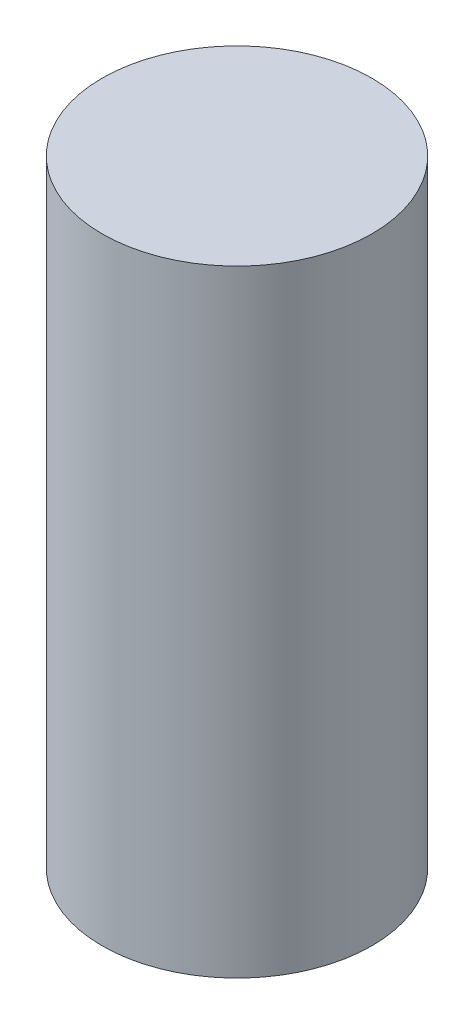
ISO-10303-21;
HEADER;
FILE_DESCRIPTION(('STEP AP214'),'2;1');
FILE_NAME('part.step','',(''),(''),'','','');
FILE_SCHEMA(('AUTOMOTIVE_DESIGN { 1 0 10303 214 1 1 1 1 }'));
ENDSEC;
DATA;
#1=APPLICATION_CONTEXT('core data for automotive mechanical design processes');
#2=APPLICATION_PROTOCOL_DEFINITION('international standard','automotive_design',2000,#1);
#3=PRODUCT_CONTEXT('',#1,'mechanical');
#4=PRODUCT('Part','Part','',(#3));
#5=PRODUCT_RELATED_PRODUCT_CATEGORY('part','',(#4));
#6=PRODUCT_DEFINITION_FORMATION('','',#4);
#7=PRODUCT_DEFINITION_CONTEXT('part definition',#1,'design');
#8=PRODUCT_DEFINITION('design','',#6,#7);
#9=PRODUCT_DEFINITION_SHAPE('','',#8);
#10=(LENGTH_UNIT() NAMED_UNIT(*) SI_UNIT(.MILLI.,.METRE.));
#11=(NAMED_UNIT(*) PLANE_ANGLE_UNIT() SI_UNIT($,.RADIAN.));
#12=(NAMED_UNIT(*) SI_UNIT($,.STERADIAN.) SOLID_ANGLE_UNIT());
#13=UNCERTAINTY_MEASURE_WITH_UNIT(LENGTH_MEASURE(1.E-05),#10,'distance_accuracy_value','');
#14=(GEOMETRIC_REPRESENTATION_CONTEXT(3) GLOBAL_UNCERTAINTY_ASSIGNED_CONTEXT((#13)) GLOBAL_UNIT_ASSIGNED_CONTEXT((#10,
#11,#12)) REPRESENTATION_CONTEXT('',''));
#15=CARTESIAN_POINT('',(0.,0.,0.));
#16=DIRECTION('',(0.,0.,1.));
#17=DIRECTION('',(1.,0.,0.));
#18=AXIS2_PLACEMENT_3D('',#15,#16,#17);
#19=CARTESIAN_POINT('',(0.,32.,0.));
#20=DIRECTION('',(0.,-1.,0.));
#21=DIRECTION('',(0.,0.,-1.));
#22=AXIS2_PLACEMENT_3D('',#19,#20,#21);
#23=CYLINDRICAL_SURFACE('',#22,7.);
#24=CARTESIAN_POINT('',(0.,32.,0.));
#25=DIRECTION('',(0.,1.,0.));
#26=DIRECTION('',(0.,0.,1.));
#27=AXIS2_PLACEMENT_3D('',#24,#25,#26);
#28=CIRCLE('',#27,7.);
#29=CARTESIAN_POINT('',(0.,32.,7.));
#30=VERTEX_POINT('',#29);
#31=EDGE_CURVE('E10',#30,#30,#28,.T.);
#32=ORIENTED_EDGE('',*,*,#31,.F.);
#33=EDGE_LOOP('',(#32));
#34=FACE_BOUND('',#33,.T.);
#35=CARTESIAN_POINT('',(0.,0.,0.));
#36=DIRECTION('',(0.,1.,0.));
#37=DIRECTION('',(0.,0.,1.));
#38=AXIS2_PLACEMENT_3D('',#35,#36,#37);
#39=CIRCLE('',#38,7.);
#40=CARTESIAN_POINT('',(0.,0.,7.));
#41=VERTEX_POINT('',#40);
#42=EDGE_CURVE('E41',#41,#41,#39,.T.);
#43=ORIENTED_EDGE('',*,*,#42,.T.);
#44=EDGE_LOOP('',(#43));
#45=FACE_BOUND('',#44,.T.);
#46=ADVANCED_FACE('F38',(#34,#45),#23,.T.);
#47=CARTESIAN_POINT('',(0.,32.,0.));
#48=DIRECTION('',(0.,1.,0.));
#49=DIRECTION('',(0.,0.,1.));
#50=AXIS2_PLACEMENT_3D('',#47,#48,#49);
#51=PLANE('',#50);
#52=ORIENTED_EDGE('',*,*,#31,.T.);
#53=EDGE_LOOP('',(#52));
#54=FACE_BOUND('',#53,.T.);
#55=ADVANCED_FACE('F53',(#54),#51,.T.);
#56=CARTESIAN_POINT('',(0.,0.,0.));
#57=DIRECTION('',(0.,1.,0.));
#58=DIRECTION('',(0.,0.,1.));
#59=AXIS2_PLACEMENT_3D('',#56,#57,#58);
#60=PLANE('',#59);
#61=ORIENTED_EDGE('',*,*,#42,.F.);
#62=EDGE_LOOP('',(#61));
#63=FACE_BOUND('',#62,.T.);
#64=ADVANCED_FACE('F51',(#63),#60,.F.);
#65=CLOSED_SHELL('',(#46,#55,#64));
#66=MANIFOLD_SOLID_BREP('B2',#65);
#67=ADVANCED_BREP_SHAPE_REPRESENTATION('',(#18,#66),#14);
#68=SHAPE_DEFINITION_REPRESENTATION(#9,#67);
ENDSEC;
END-ISO-10303-21;
